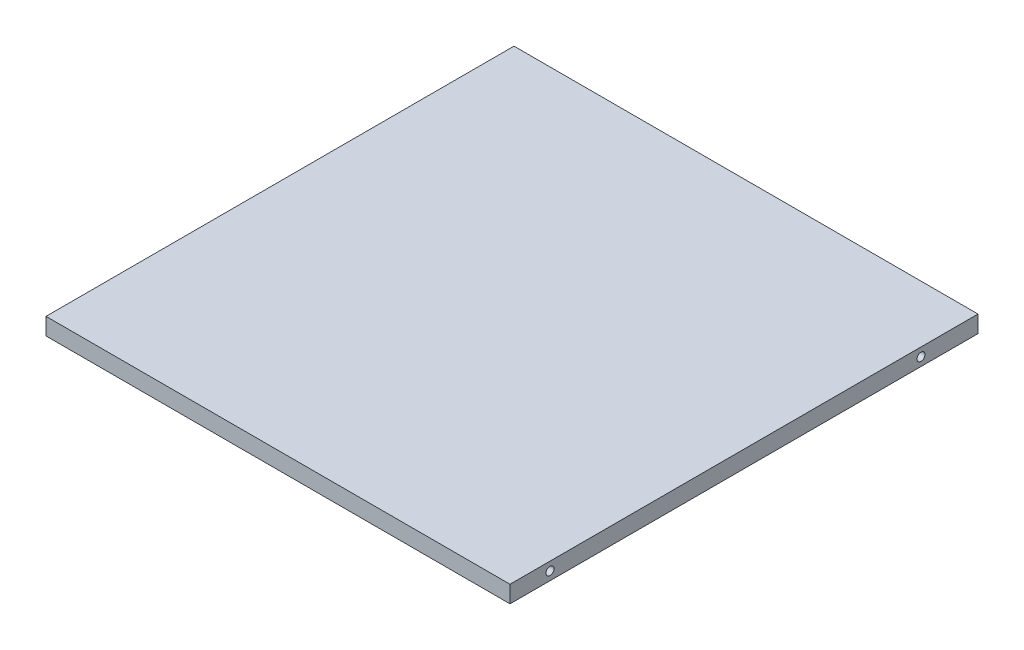
ISO-10303-21;
HEADER;
FILE_DESCRIPTION(('STEP AP214'),'2;1');
FILE_NAME('part.step','',(''),(''),'','','');
FILE_SCHEMA(('AUTOMOTIVE_DESIGN { 1 0 10303 214 1 1 1 1 }'));
ENDSEC;
DATA;
#1=APPLICATION_CONTEXT('core data for automotive mechanical design processes');
#2=APPLICATION_PROTOCOL_DEFINITION('international standard','automotive_design',2000,#1);
#3=PRODUCT_CONTEXT('',#1,'mechanical');
#4=PRODUCT('Part','Part','',(#3));
#5=PRODUCT_RELATED_PRODUCT_CATEGORY('part','',(#4));
#6=PRODUCT_DEFINITION_FORMATION('','',#4);
#7=PRODUCT_DEFINITION_CONTEXT('part definition',#1,'design');
#8=PRODUCT_DEFINITION('design','',#6,#7);
#9=PRODUCT_DEFINITION_SHAPE('','',#8);
#10=(LENGTH_UNIT() NAMED_UNIT(*) SI_UNIT(.MILLI.,.METRE.));
#11=(NAMED_UNIT(*) PLANE_ANGLE_UNIT() SI_UNIT($,.RADIAN.));
#12=(NAMED_UNIT(*) SI_UNIT($,.STERADIAN.) SOLID_ANGLE_UNIT());
#13=UNCERTAINTY_MEASURE_WITH_UNIT(LENGTH_MEASURE(1.E-05),#10,'distance_accuracy_value','');
#14=(GEOMETRIC_REPRESENTATION_CONTEXT(3) GLOBAL_UNCERTAINTY_ASSIGNED_CONTEXT((#13)) GLOBAL_UNIT_ASSIGNED_CONTEXT((#10,
#11,#12)) REPRESENTATION_CONTEXT('',''));
#15=CARTESIAN_POINT('',(0.,0.,0.));
#16=DIRECTION('',(0.,0.,1.));
#17=DIRECTION('',(1.,0.,0.));
#18=AXIS2_PLACEMENT_3D('',#15,#16,#17);
#19=CARTESIAN_POINT('',(0.,17.,0.));
#20=DIRECTION('',(1.,0.,0.));
#21=DIRECTION('',(0.,0.,-1.));
#22=AXIS2_PLACEMENT_3D('',#19,#20,#21);
#23=PLANE('',#22);
#24=CARTESIAN_POINT('',(0.,8.5,-40.));
#25=DIRECTION('',(-1.,0.,0.));
#26=DIRECTION('',(0.,0.,1.));
#27=AXIS2_PLACEMENT_3D('',#24,#25,#26);
#28=CIRCLE('',#27,3.99999999999999);
#29=CARTESIAN_POINT('',(0.,8.5,-36.));
#30=VERTEX_POINT('',#29);
#31=EDGE_CURVE('E128',#30,#30,#28,.T.);
#32=ORIENTED_EDGE('',*,*,#31,.F.);
#33=EDGE_LOOP('',(#32));
#34=FACE_BOUND('',#33,.T.);
#35=CARTESIAN_POINT('',(0.,8.5,-411.));
#36=DIRECTION('',(-1.,0.,0.));
#37=DIRECTION('',(0.,0.,1.));
#38=AXIS2_PLACEMENT_3D('',#35,#36,#37);
#39=CIRCLE('',#38,3.99999999999999);
#40=CARTESIAN_POINT('',(0.,8.5,-407.));
#41=VERTEX_POINT('',#40);
#42=EDGE_CURVE('E122',#41,#41,#39,.T.);
#43=ORIENTED_EDGE('',*,*,#42,.F.);
#44=EDGE_LOOP('',(#43));
#45=FACE_BOUND('',#44,.T.);
#46=DIRECTION('',(0.,0.,1.));
#47=VECTOR('',#46,1.);
#48=CARTESIAN_POINT('',(0.,0.,0.));
#49=LINE('',#48,#47);
#50=CARTESIAN_POINT('',(0.,0.,-468.));
#51=VERTEX_POINT('',#50);
#52=CARTESIAN_POINT('',(0.,0.,0.));
#53=VERTEX_POINT('',#52);
#54=EDGE_CURVE('E96',#51,#53,#49,.T.);
#55=ORIENTED_EDGE('',*,*,#54,.T.);
#56=DIRECTION('',(0.,-1.,0.));
#57=VECTOR('',#56,1.);
#58=CARTESIAN_POINT('',(0.,17.,0.));
#59=LINE('',#58,#57);
#60=CARTESIAN_POINT('',(0.,17.,0.));
#61=VERTEX_POINT('',#60);
#62=EDGE_CURVE('E11',#61,#53,#59,.T.);
#63=ORIENTED_EDGE('',*,*,#62,.F.);
#64=DIRECTION('',(0.,0.,1.));
#65=VECTOR('',#64,1.);
#66=CARTESIAN_POINT('',(0.,17.,0.));
#67=LINE('',#66,#65);
#68=CARTESIAN_POINT('',(0.,17.,-468.));
#69=VERTEX_POINT('',#68);
#70=EDGE_CURVE('E84',#69,#61,#67,.T.);
#71=ORIENTED_EDGE('',*,*,#70,.F.);
#72=DIRECTION('',(0.,-1.,0.));
#73=VECTOR('',#72,1.);
#74=CARTESIAN_POINT('',(0.,17.,-468.));
#75=LINE('',#74,#73);
#76=EDGE_CURVE('E92',#69,#51,#75,.T.);
#77=ORIENTED_EDGE('',*,*,#76,.T.);
#78=EDGE_LOOP('',(#55,#63,#71,#77));
#79=FACE_BOUND('',#78,.T.);
#80=ADVANCED_FACE('F33',(#34,#45,#79),#23,.F.);
#81=CARTESIAN_POINT('',(0.,17.,0.));
#82=DIRECTION('',(0.,0.,-1.));
#83=DIRECTION('',(-1.,0.,0.));
#84=AXIS2_PLACEMENT_3D('',#81,#82,#83);
#85=PLANE('',#84);
#86=DIRECTION('',(1.,0.,0.));
#87=VECTOR('',#86,1.);
#88=CARTESIAN_POINT('',(0.,0.,0.));
#89=LINE('',#88,#87);
#90=CARTESIAN_POINT('',(464.,0.,0.));
#91=VERTEX_POINT('',#90);
#92=EDGE_CURVE('E88',#53,#91,#89,.T.);
#93=ORIENTED_EDGE('',*,*,#92,.T.);
#94=DIRECTION('',(0.,-1.,0.));
#95=VECTOR('',#94,1.);
#96=CARTESIAN_POINT('',(464.,17.,0.));
#97=LINE('',#96,#95);
#98=CARTESIAN_POINT('',(464.,17.,0.));
#99=VERTEX_POINT('',#98);
#100=EDGE_CURVE('E41',#99,#91,#97,.T.);
#101=ORIENTED_EDGE('',*,*,#100,.F.);
#102=DIRECTION('',(1.,0.,0.));
#103=VECTOR('',#102,1.);
#104=CARTESIAN_POINT('',(0.,17.,0.));
#105=LINE('',#104,#103);
#106=EDGE_CURVE('E79',#61,#99,#105,.T.);
#107=ORIENTED_EDGE('',*,*,#106,.F.);
#108=ORIENTED_EDGE('',*,*,#62,.T.);
#109=EDGE_LOOP('',(#93,#101,#107,#108));
#110=FACE_BOUND('',#109,.T.);
#111=ADVANCED_FACE('F87',(#110),#85,.F.);
#112=CARTESIAN_POINT('',(464.,17.,0.));
#113=DIRECTION('',(-1.,0.,0.));
#114=DIRECTION('',(0.,0.,1.));
#115=AXIS2_PLACEMENT_3D('',#112,#113,#114);
#116=PLANE('',#115);
#117=CARTESIAN_POINT('',(464.,8.5,-411.));
#118=DIRECTION('',(1.,0.,0.));
#119=DIRECTION('',(0.,0.,-1.));
#120=AXIS2_PLACEMENT_3D('',#117,#118,#119);
#121=CIRCLE('',#120,3.99999999999999);
#122=CARTESIAN_POINT('',(464.,8.5,-415.));
#123=VERTEX_POINT('',#122);
#124=EDGE_CURVE('E116',#123,#123,#121,.T.);
#125=ORIENTED_EDGE('',*,*,#124,.F.);
#126=EDGE_LOOP('',(#125));
#127=FACE_BOUND('',#126,.T.);
#128=CARTESIAN_POINT('',(464.,8.5,-40.));
#129=DIRECTION('',(1.,0.,0.));
#130=DIRECTION('',(0.,0.,-1.));
#131=AXIS2_PLACEMENT_3D('',#128,#129,#130);
#132=CIRCLE('',#131,4.);
#133=CARTESIAN_POINT('',(464.,8.5,-44.));
#134=VERTEX_POINT('',#133);
#135=EDGE_CURVE('E110',#134,#134,#132,.T.);
#136=ORIENTED_EDGE('',*,*,#135,.F.);
#137=EDGE_LOOP('',(#136));
#138=FACE_BOUND('',#137,.T.);
#139=DIRECTION('',(0.,0.,-1.));
#140=VECTOR('',#139,1.);
#141=CARTESIAN_POINT('',(464.,0.,0.));
#142=LINE('',#141,#140);
#143=CARTESIAN_POINT('',(464.,0.,-468.));
#144=VERTEX_POINT('',#143);
#145=EDGE_CURVE('E66',#91,#144,#142,.T.);
#146=ORIENTED_EDGE('',*,*,#145,.T.);
#147=DIRECTION('',(0.,-1.,0.));
#148=VECTOR('',#147,1.);
#149=CARTESIAN_POINT('',(464.,17.,-468.));
#150=LINE('',#149,#148);
#151=CARTESIAN_POINT('',(464.,17.,-468.));
#152=VERTEX_POINT('',#151);
#153=EDGE_CURVE('E89',#152,#144,#150,.T.);
#154=ORIENTED_EDGE('',*,*,#153,.F.);
#155=DIRECTION('',(0.,0.,-1.));
#156=VECTOR('',#155,1.);
#157=CARTESIAN_POINT('',(464.,17.,0.));
#158=LINE('',#157,#156);
#159=EDGE_CURVE('E82',#99,#152,#158,.T.);
#160=ORIENTED_EDGE('',*,*,#159,.F.);
#161=ORIENTED_EDGE('',*,*,#100,.T.);
#162=EDGE_LOOP('',(#146,#154,#160,#161));
#163=FACE_BOUND('',#162,.T.);
#164=ADVANCED_FACE('F90',(#127,#138,#163),#116,.F.);
#165=CARTESIAN_POINT('',(0.,17.,-468.));
#166=DIRECTION('',(0.,0.,1.));
#167=DIRECTION('',(1.,0.,0.));
#168=AXIS2_PLACEMENT_3D('',#165,#166,#167);
#169=PLANE('',#168);
#170=DIRECTION('',(-1.,0.,0.));
#171=VECTOR('',#170,1.);
#172=CARTESIAN_POINT('',(0.,0.,-468.));
#173=LINE('',#172,#171);
#174=EDGE_CURVE('E72',#144,#51,#173,.T.);
#175=ORIENTED_EDGE('',*,*,#174,.T.);
#176=ORIENTED_EDGE('',*,*,#76,.F.);
#177=DIRECTION('',(-1.,0.,0.));
#178=VECTOR('',#177,1.);
#179=CARTESIAN_POINT('',(0.,17.,-468.));
#180=LINE('',#179,#178);
#181=EDGE_CURVE('E49',#152,#69,#180,.T.);
#182=ORIENTED_EDGE('',*,*,#181,.F.);
#183=ORIENTED_EDGE('',*,*,#153,.T.);
#184=EDGE_LOOP('',(#175,#176,#182,#183));
#185=FACE_BOUND('',#184,.T.);
#186=ADVANCED_FACE('F104',(#185),#169,.F.);
#187=CARTESIAN_POINT('',(0.,17.,0.));
#188=DIRECTION('',(0.,-1.,0.));
#189=DIRECTION('',(0.,0.,-1.));
#190=AXIS2_PLACEMENT_3D('',#187,#188,#189);
#191=PLANE('',#190);
#192=ORIENTED_EDGE('',*,*,#70,.T.);
#193=ORIENTED_EDGE('',*,*,#106,.T.);
#194=ORIENTED_EDGE('',*,*,#159,.T.);
#195=ORIENTED_EDGE('',*,*,#181,.T.);
#196=EDGE_LOOP('',(#192,#193,#194,#195));
#197=FACE_BOUND('',#196,.T.);
#198=ADVANCED_FACE('F80',(#197),#191,.F.);
#199=CARTESIAN_POINT('',(0.,0.,0.));
#200=DIRECTION('',(0.,-1.,0.));
#201=DIRECTION('',(0.,0.,-1.));
#202=AXIS2_PLACEMENT_3D('',#199,#200,#201);
#203=PLANE('',#202);
#204=ORIENTED_EDGE('',*,*,#54,.F.);
#205=ORIENTED_EDGE('',*,*,#174,.F.);
#206=ORIENTED_EDGE('',*,*,#145,.F.);
#207=ORIENTED_EDGE('',*,*,#92,.F.);
#208=EDGE_LOOP('',(#204,#205,#206,#207));
#209=FACE_BOUND('',#208,.T.);
#210=ADVANCED_FACE('F107',(#209),#203,.T.);
#211=CARTESIAN_POINT('',(439.,8.5,-40.));
#212=DIRECTION('',(1.,0.,0.));
#213=DIRECTION('',(0.,0.,-1.));
#214=AXIS2_PLACEMENT_3D('',#211,#212,#213);
#215=CYLINDRICAL_SURFACE('',#214,4.);
#216=CARTESIAN_POINT('',(439.,8.5,-40.));
#217=DIRECTION('',(1.,0.,0.));
#218=DIRECTION('',(0.,0.,-1.));
#219=AXIS2_PLACEMENT_3D('',#216,#217,#218);
#220=CIRCLE('',#219,4.);
#221=CARTESIAN_POINT('',(439.,8.5,-44.));
#222=VERTEX_POINT('',#221);
#223=EDGE_CURVE('E99',#222,#222,#220,.T.);
#224=ORIENTED_EDGE('',*,*,#223,.F.);
#225=EDGE_LOOP('',(#224));
#226=FACE_BOUND('',#225,.T.);
#227=ORIENTED_EDGE('',*,*,#135,.T.);
#228=EDGE_LOOP('',(#227));
#229=FACE_BOUND('',#228,.T.);
#230=ADVANCED_FACE('F169',(#226,#229),#215,.F.);
#231=CARTESIAN_POINT('',(439.,8.5,-40.));
#232=DIRECTION('',(1.,0.,0.));
#233=DIRECTION('',(0.,0.,-1.));
#234=AXIS2_PLACEMENT_3D('',#231,#232,#233);
#235=PLANE('',#234);
#236=ORIENTED_EDGE('',*,*,#223,.T.);
#237=EDGE_LOOP('',(#236));
#238=FACE_BOUND('',#237,.T.);
#239=ADVANCED_FACE('F165',(#238),#235,.T.);
#240=CARTESIAN_POINT('',(439.,8.5,-411.));
#241=DIRECTION('',(1.,0.,0.));
#242=DIRECTION('',(0.,0.,-1.));
#243=AXIS2_PLACEMENT_3D('',#240,#241,#242);
#244=CYLINDRICAL_SURFACE('',#243,3.99999999999999);
#245=CARTESIAN_POINT('',(439.,8.5,-411.));
#246=DIRECTION('',(1.,0.,0.));
#247=DIRECTION('',(0.,0.,-1.));
#248=AXIS2_PLACEMENT_3D('',#245,#246,#247);
#249=CIRCLE('',#248,3.99999999999999);
#250=CARTESIAN_POINT('',(439.,8.5,-415.));
#251=VERTEX_POINT('',#250);
#252=EDGE_CURVE('E113',#251,#251,#249,.T.);
#253=ORIENTED_EDGE('',*,*,#252,.F.);
#254=EDGE_LOOP('',(#253));
#255=FACE_BOUND('',#254,.T.);
#256=ORIENTED_EDGE('',*,*,#124,.T.);
#257=EDGE_LOOP('',(#256));
#258=FACE_BOUND('',#257,.T.);
#259=ADVANCED_FACE('F158',(#255,#258),#244,.F.);
#260=CARTESIAN_POINT('',(439.,8.5,-411.));
#261=DIRECTION('',(1.,0.,0.));
#262=DIRECTION('',(0.,0.,-1.));
#263=AXIS2_PLACEMENT_3D('',#260,#261,#262);
#264=PLANE('',#263);
#265=ORIENTED_EDGE('',*,*,#252,.T.);
#266=EDGE_LOOP('',(#265));
#267=FACE_BOUND('',#266,.T.);
#268=ADVANCED_FACE('F149',(#267),#264,.T.);
#269=CARTESIAN_POINT('',(25.,8.5,-411.));
#270=DIRECTION('',(-1.,0.,0.));
#271=DIRECTION('',(0.,0.,1.));
#272=AXIS2_PLACEMENT_3D('',#269,#270,#271);
#273=CYLINDRICAL_SURFACE('',#272,3.99999999999999);
#274=CARTESIAN_POINT('',(25.,8.5,-411.));
#275=DIRECTION('',(-1.,0.,0.));
#276=DIRECTION('',(0.,0.,1.));
#277=AXIS2_PLACEMENT_3D('',#274,#275,#276);
#278=CIRCLE('',#277,3.99999999999999);
#279=CARTESIAN_POINT('',(25.,8.5,-407.));
#280=VERTEX_POINT('',#279);
#281=EDGE_CURVE('E119',#280,#280,#278,.T.);
#282=ORIENTED_EDGE('',*,*,#281,.F.);
#283=EDGE_LOOP('',(#282));
#284=FACE_BOUND('',#283,.T.);
#285=ORIENTED_EDGE('',*,*,#42,.T.);
#286=EDGE_LOOP('',(#285));
#287=FACE_BOUND('',#286,.T.);
#288=ADVANCED_FACE('F147',(#284,#287),#273,.F.);
#289=CARTESIAN_POINT('',(25.,8.5,-411.));
#290=DIRECTION('',(-1.,0.,0.));
#291=DIRECTION('',(0.,0.,1.));
#292=AXIS2_PLACEMENT_3D('',#289,#290,#291);
#293=PLANE('',#292);
#294=ORIENTED_EDGE('',*,*,#281,.T.);
#295=EDGE_LOOP('',(#294));
#296=FACE_BOUND('',#295,.T.);
#297=ADVANCED_FACE('F139',(#296),#293,.T.);
#298=CARTESIAN_POINT('',(25.,8.5,-40.));
#299=DIRECTION('',(-1.,0.,0.));
#300=DIRECTION('',(0.,0.,1.));
#301=AXIS2_PLACEMENT_3D('',#298,#299,#300);
#302=CYLINDRICAL_SURFACE('',#301,3.99999999999999);
#303=CARTESIAN_POINT('',(25.,8.5,-40.));
#304=DIRECTION('',(-1.,0.,0.));
#305=DIRECTION('',(0.,0.,1.));
#306=AXIS2_PLACEMENT_3D('',#303,#304,#305);
#307=CIRCLE('',#306,3.99999999999999);
#308=CARTESIAN_POINT('',(25.,8.5,-36.));
#309=VERTEX_POINT('',#308);
#310=EDGE_CURVE('E125',#309,#309,#307,.T.);
#311=ORIENTED_EDGE('',*,*,#310,.F.);
#312=EDGE_LOOP('',(#311));
#313=FACE_BOUND('',#312,.T.);
#314=ORIENTED_EDGE('',*,*,#31,.T.);
#315=EDGE_LOOP('',(#314));
#316=FACE_BOUND('',#315,.T.);
#317=ADVANCED_FACE('F136',(#313,#316),#302,.F.);
#318=CARTESIAN_POINT('',(25.,8.5,-40.));
#319=DIRECTION('',(-1.,0.,0.));
#320=DIRECTION('',(0.,0.,1.));
#321=AXIS2_PLACEMENT_3D('',#318,#319,#320);
#322=PLANE('',#321);
#323=ORIENTED_EDGE('',*,*,#310,.T.);
#324=EDGE_LOOP('',(#323));
#325=FACE_BOUND('',#324,.T.);
#326=ADVANCED_FACE('F134',(#325),#322,.T.);
#327=CLOSED_SHELL('',(#80,#111,#164,#186,#198,#210,#230,#239,#259,#268,#288,#297,#317,#326));
#328=MANIFOLD_SOLID_BREP('B2',#327);
#329=ADVANCED_BREP_SHAPE_REPRESENTATION('',(#18,#328),#14);
#330=SHAPE_DEFINITION_REPRESENTATION(#9,#329);
ENDSEC;
END-ISO-10303-21;
